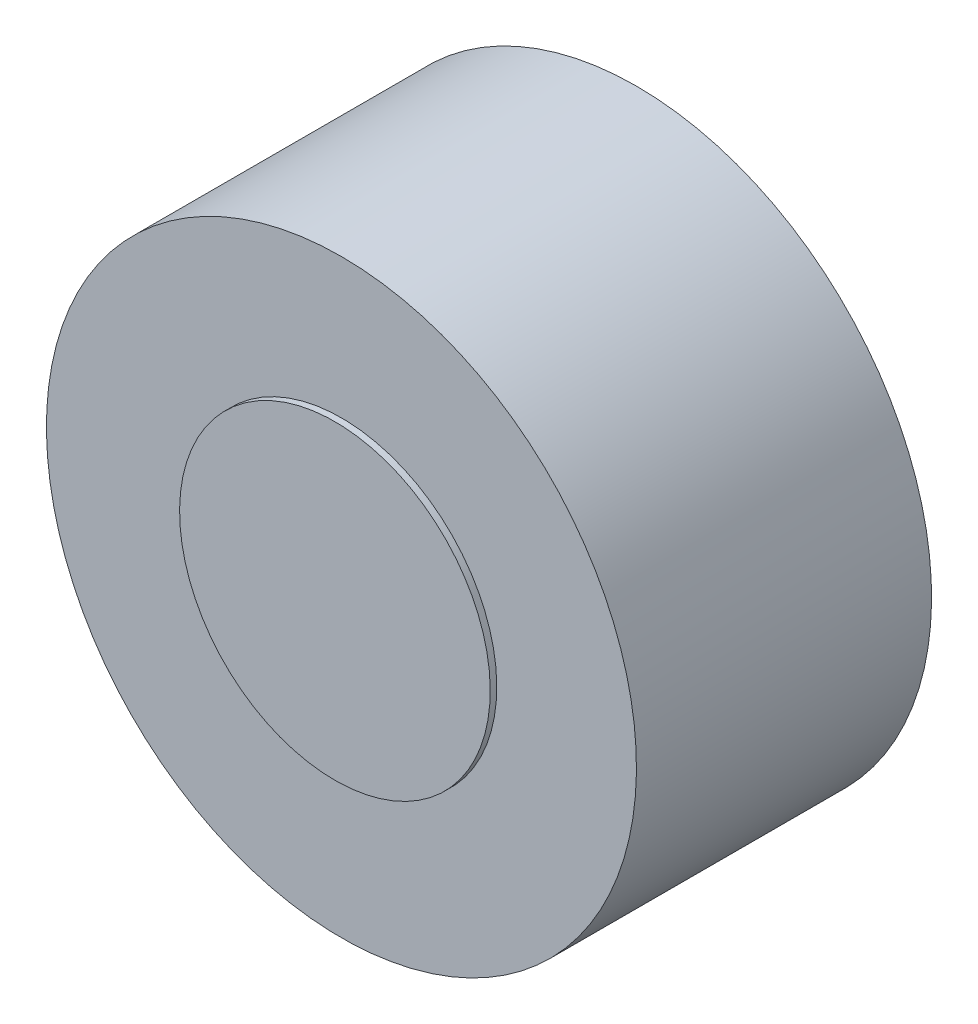
ISO-10303-21;
HEADER;
FILE_DESCRIPTION(('STEP AP214'),'2;1');
FILE_NAME('part.step','',(''),(''),'','','');
FILE_SCHEMA(('AUTOMOTIVE_DESIGN { 1 0 10303 214 1 1 1 1 }'));
ENDSEC;
DATA;
#1=APPLICATION_CONTEXT('core data for automotive mechanical design processes');
#2=APPLICATION_PROTOCOL_DEFINITION('international standard','automotive_design',2000,#1);
#3=PRODUCT_CONTEXT('',#1,'mechanical');
#4=PRODUCT('Part','Part','',(#3));
#5=PRODUCT_RELATED_PRODUCT_CATEGORY('part','',(#4));
#6=PRODUCT_DEFINITION_FORMATION('','',#4);
#7=PRODUCT_DEFINITION_CONTEXT('part definition',#1,'design');
#8=PRODUCT_DEFINITION('design','',#6,#7);
#9=PRODUCT_DEFINITION_SHAPE('','',#8);
#10=(LENGTH_UNIT() NAMED_UNIT(*) SI_UNIT(.MILLI.,.METRE.));
#11=(NAMED_UNIT(*) PLANE_ANGLE_UNIT() SI_UNIT($,.RADIAN.));
#12=(NAMED_UNIT(*) SI_UNIT($,.STERADIAN.) SOLID_ANGLE_UNIT());
#13=UNCERTAINTY_MEASURE_WITH_UNIT(LENGTH_MEASURE(1.E-05),#10,'distance_accuracy_value','');
#14=(GEOMETRIC_REPRESENTATION_CONTEXT(3) GLOBAL_UNCERTAINTY_ASSIGNED_CONTEXT((#13)) GLOBAL_UNIT_ASSIGNED_CONTEXT((#10,
#11,#12)) REPRESENTATION_CONTEXT('',''));
#15=CARTESIAN_POINT('',(0.,0.,0.));
#16=DIRECTION('',(0.,0.,1.));
#17=DIRECTION('',(1.,0.,0.));
#18=AXIS2_PLACEMENT_3D('',#15,#16,#17);
#19=CARTESIAN_POINT('',(19.8104450030768,-19.8104450030789,23.17275));
#20=DIRECTION('',(0.,0.,1.));
#21=DIRECTION('',(-0.999886454252792,-0.0150691274392579,0.));
#22=AXIS2_PLACEMENT_3D('',#19,#20,#21);
#23=PLANE('',#22);
#24=CARTESIAN_POINT('',(19.8104450030768,-19.8104450030789,23.17275));
#25=DIRECTION('',(0.,0.,1.));
#26=DIRECTION('',(0.0150691274392579,-0.999886454252792,0.));
#27=AXIS2_PLACEMENT_3D('',#24,#25,#26);
#28=CIRCLE('',#27,6.35);
#29=CARTESIAN_POINT('',(19.906133962316,-26.1597239875841,23.17275));
#30=VERTEX_POINT('',#29);
#31=EDGE_CURVE('E24',#30,#30,#28,.T.);
#32=ORIENTED_EDGE('',*,*,#31,.T.);
#33=EDGE_LOOP('',(#32));
#34=FACE_BOUND('',#33,.T.);
#35=ADVANCED_FACE('F15',(#34),#23,.T.);
#36=CARTESIAN_POINT('',(19.9826851271207,-31.2391470035464,22.90525));
#37=DIRECTION('',(0.,0.,-1.));
#38=DIRECTION('',(0.999886454252792,0.0150691274392579,0.));
#39=AXIS2_PLACEMENT_3D('',#36,#37,#38);
#40=PLANE('',#39);
#41=CARTESIAN_POINT('',(19.8104450030768,-19.8104450030789,22.90525));
#42=DIRECTION('',(0.,0.,1.));
#43=DIRECTION('',(0.999886454252792,0.0150691274392579,0.));
#44=AXIS2_PLACEMENT_3D('',#41,#42,#43);
#45=CIRCLE('',#44,6.35);
#46=CARTESIAN_POINT('',(26.159723987582,-19.7147560438396,22.90525));
#47=VERTEX_POINT('',#46);
#48=EDGE_CURVE('E10',#47,#47,#45,.T.);
#49=ORIENTED_EDGE('',*,*,#48,.F.);
#50=EDGE_LOOP('',(#49));
#51=FACE_BOUND('',#50,.T.);
#52=CARTESIAN_POINT('',(19.8104450030768,-19.8104450030789,22.90525));
#53=DIRECTION('',(0.,0.,-1.));
#54=DIRECTION('',(0.,1.,0.));
#55=AXIS2_PLACEMENT_3D('',#52,#53,#54);
#56=CIRCLE('',#55,12.0613930283386);
#57=CARTESIAN_POINT('',(19.8104450030768,-7.74905197474028,22.90525));
#58=VERTEX_POINT('',#57);
#59=EDGE_CURVE('E36',#58,#58,#56,.T.);
#60=ORIENTED_EDGE('',*,*,#59,.F.);
#61=EDGE_LOOP('',(#60));
#62=FACE_BOUND('',#61,.T.);
#63=ADVANCED_FACE('F65',(#51,#62),#40,.F.);
#64=CARTESIAN_POINT('',(19.8104450030768,-19.8104450030789,23.17275));
#65=DIRECTION('',(0.,0.,-1.));
#66=DIRECTION('',(-0.0150691274392579,0.999886454252792,0.));
#67=AXIS2_PLACEMENT_3D('',#64,#65,#66);
#68=CYLINDRICAL_SURFACE('',#67,6.35);
#69=ORIENTED_EDGE('',*,*,#48,.T.);
#70=EDGE_LOOP('',(#69));
#71=FACE_BOUND('',#70,.T.);
#72=ORIENTED_EDGE('',*,*,#31,.F.);
#73=EDGE_LOOP('',(#72));
#74=FACE_BOUND('',#73,.T.);
#75=ADVANCED_FACE('F57',(#71,#74),#68,.T.);
#76=CARTESIAN_POINT('',(19.8104450030768,-19.8104450030789,16.87275));
#77=DIRECTION('',(0.,0.,-1.));
#78=DIRECTION('',(0.999886454252792,0.0150691274392579,0.));
#79=AXIS2_PLACEMENT_3D('',#76,#77,#78);
#80=CYLINDRICAL_SURFACE('',#79,12.0613930283386);
#81=CARTESIAN_POINT('',(19.8104450030768,-19.8104450030789,10.8402500000002));
#82=DIRECTION('',(0.,0.,-1.));
#83=DIRECTION('',(0.,1.,0.));
#84=AXIS2_PLACEMENT_3D('',#81,#82,#83);
#85=CIRCLE('',#84,12.0613930283386);
#86=CARTESIAN_POINT('',(19.8104450030768,-7.74905197474028,10.8402500000002));
#87=VERTEX_POINT('',#86);
#88=EDGE_CURVE('E47',#87,#87,#85,.T.);
#89=ORIENTED_EDGE('',*,*,#88,.F.);
#90=EDGE_LOOP('',(#89));
#91=FACE_BOUND('',#90,.T.);
#92=ORIENTED_EDGE('',*,*,#59,.T.);
#93=EDGE_LOOP('',(#92));
#94=FACE_BOUND('',#93,.T.);
#95=ADVANCED_FACE('F55',(#91,#94),#80,.T.);
#96=CARTESIAN_POINT('',(19.8104450030768,-19.8104450030789,10.5727500000002));
#97=DIRECTION('',(0.,0.,1.));
#98=DIRECTION('',(-0.999886454252792,-0.0150691274392579,0.));
#99=AXIS2_PLACEMENT_3D('',#96,#97,#98);
#100=PLANE('',#99);
#101=CARTESIAN_POINT('',(19.8104450030768,-19.8104450030789,10.5727500000002));
#102=DIRECTION('',(0.,0.,1.));
#103=DIRECTION('',(0.0150691274392579,-0.999886454252792,0.));
#104=AXIS2_PLACEMENT_3D('',#101,#102,#103);
#105=CIRCLE('',#104,6.35);
#106=CARTESIAN_POINT('',(19.9061339623161,-26.1597239875841,10.5727500000002));
#107=VERTEX_POINT('',#106);
#108=EDGE_CURVE('E19',#107,#107,#105,.T.);
#109=ORIENTED_EDGE('',*,*,#108,.F.);
#110=EDGE_LOOP('',(#109));
#111=FACE_BOUND('',#110,.T.);
#112=ADVANCED_FACE('F17',(#111),#100,.F.);
#113=ORIENTED_EDGE('',*,*,#108,.T.);
#114=EDGE_LOOP('',(#113));
#115=FACE_BOUND('',#114,.T.);
#116=CARTESIAN_POINT('',(19.8104450030768,-19.8104450030789,10.8402500000002));
#117=DIRECTION('',(0.,0.,-1.));
#118=DIRECTION('',(-0.999886454252792,-0.0150691274392579,0.));
#119=AXIS2_PLACEMENT_3D('',#116,#117,#118);
#120=CIRCLE('',#119,6.35);
#121=CARTESIAN_POINT('',(13.4611660185716,-19.9061339623182,10.8402500000002));
#122=VERTEX_POINT('',#121);
#123=EDGE_CURVE('E38',#122,#122,#120,.T.);
#124=ORIENTED_EDGE('',*,*,#123,.T.);
#125=EDGE_LOOP('',(#124));
#126=FACE_BOUND('',#125,.T.);
#127=ADVANCED_FACE('F63',(#115,#126),#68,.T.);
#128=CARTESIAN_POINT('',(19.8104450030768,-19.8104450030789,10.8402500000002));
#129=DIRECTION('',(0.,0.,1.));
#130=DIRECTION('',(-0.0150691274392579,0.999886454252792,0.));
#131=AXIS2_PLACEMENT_3D('',#128,#129,#130);
#132=PLANE('',#131);
#133=ORIENTED_EDGE('',*,*,#123,.F.);
#134=EDGE_LOOP('',(#133));
#135=FACE_BOUND('',#134,.T.);
#136=ORIENTED_EDGE('',*,*,#88,.T.);
#137=EDGE_LOOP('',(#136));
#138=FACE_BOUND('',#137,.T.);
#139=ADVANCED_FACE('F53',(#135,#138),#132,.F.);
#140=CLOSED_SHELL('',(#35,#63,#75,#95,#112,#127,#139));
#141=MANIFOLD_SOLID_BREP('B1',#140);
#142=ADVANCED_BREP_SHAPE_REPRESENTATION('',(#18,#141),#14);
#143=SHAPE_DEFINITION_REPRESENTATION(#9,#142);
ENDSEC;
END-ISO-10303-21;
